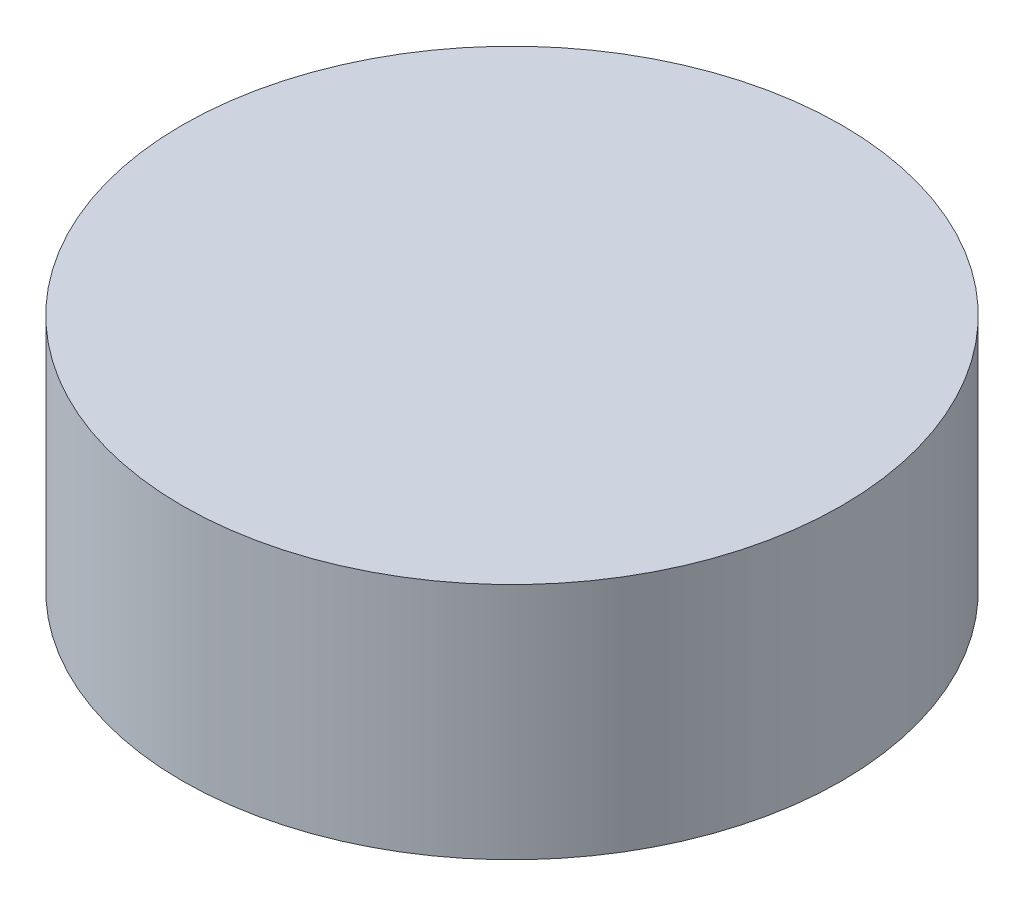
ISO-10303-21;
HEADER;
FILE_DESCRIPTION(('STEP AP214'),'2;1');
FILE_NAME('part.step','',(''),(''),'','','');
FILE_SCHEMA(('AUTOMOTIVE_DESIGN { 1 0 10303 214 1 1 1 1 }'));
ENDSEC;
DATA;
#1=APPLICATION_CONTEXT('core data for automotive mechanical design processes');
#2=APPLICATION_PROTOCOL_DEFINITION('international standard','automotive_design',2000,#1);
#3=PRODUCT_CONTEXT('',#1,'mechanical');
#4=PRODUCT('Part','Part','',(#3));
#5=PRODUCT_RELATED_PRODUCT_CATEGORY('part','',(#4));
#6=PRODUCT_DEFINITION_FORMATION('','',#4);
#7=PRODUCT_DEFINITION_CONTEXT('part definition',#1,'design');
#8=PRODUCT_DEFINITION('design','',#6,#7);
#9=PRODUCT_DEFINITION_SHAPE('','',#8);
#10=(LENGTH_UNIT() NAMED_UNIT(*) SI_UNIT(.MILLI.,.METRE.));
#11=(NAMED_UNIT(*) PLANE_ANGLE_UNIT() SI_UNIT($,.RADIAN.));
#12=(NAMED_UNIT(*) SI_UNIT($,.STERADIAN.) SOLID_ANGLE_UNIT());
#13=UNCERTAINTY_MEASURE_WITH_UNIT(LENGTH_MEASURE(1.E-05),#10,'distance_accuracy_value','');
#14=(GEOMETRIC_REPRESENTATION_CONTEXT(3) GLOBAL_UNCERTAINTY_ASSIGNED_CONTEXT((#13)) GLOBAL_UNIT_ASSIGNED_CONTEXT((#10,
#11,#12)) REPRESENTATION_CONTEXT('',''));
#15=CARTESIAN_POINT('',(0.,0.,0.));
#16=DIRECTION('',(0.,0.,1.));
#17=DIRECTION('',(1.,0.,0.));
#18=AXIS2_PLACEMENT_3D('',#15,#16,#17);
#19=CARTESIAN_POINT('',(-0.498,6.99999999999999,0.));
#20=DIRECTION('',(0.,1.,0.));
#21=DIRECTION('',(0.,0.,1.));
#22=AXIS2_PLACEMENT_3D('',#19,#20,#21);
#23=CYLINDRICAL_SURFACE('',#22,12.45);
#24=CARTESIAN_POINT('',(-0.498,6.99999999999999,0.));
#25=DIRECTION('',(0.,1.,0.));
#26=DIRECTION('',(0.,0.,1.));
#27=AXIS2_PLACEMENT_3D('',#24,#25,#26);
#28=CIRCLE('',#27,12.45);
#29=CARTESIAN_POINT('',(-0.498,6.99999999999999,12.45));
#30=VERTEX_POINT('',#29);
#31=EDGE_CURVE('E10',#30,#30,#28,.T.);
#32=ORIENTED_EDGE('',*,*,#31,.T.);
#33=EDGE_LOOP('',(#32));
#34=FACE_BOUND('',#33,.T.);
#35=CARTESIAN_POINT('',(-0.498,16.,0.));
#36=DIRECTION('',(0.,1.,0.));
#37=DIRECTION('',(0.,0.,1.));
#38=AXIS2_PLACEMENT_3D('',#35,#36,#37);
#39=CIRCLE('',#38,12.45);
#40=CARTESIAN_POINT('',(-0.498,16.,12.45));
#41=VERTEX_POINT('',#40);
#42=EDGE_CURVE('E43',#41,#41,#39,.T.);
#43=ORIENTED_EDGE('',*,*,#42,.F.);
#44=EDGE_LOOP('',(#43));
#45=FACE_BOUND('',#44,.T.);
#46=ADVANCED_FACE('F40',(#34,#45),#23,.T.);
#47=CARTESIAN_POINT('',(-0.498,6.99999999999999,0.));
#48=DIRECTION('',(0.,1.,0.));
#49=DIRECTION('',(0.,0.,1.));
#50=AXIS2_PLACEMENT_3D('',#47,#48,#49);
#51=PLANE('',#50);
#52=CARTESIAN_POINT('',(-0.5,6.99999999999999,0.));
#53=DIRECTION('',(0.,-1.,0.));
#54=DIRECTION('',(0.,0.,-1.));
#55=AXIS2_PLACEMENT_3D('',#52,#53,#54);
#56=CIRCLE('',#55,6.99999999999999);
#57=CARTESIAN_POINT('',(-0.5,6.99999999999999,-6.99999999999999));
#58=VERTEX_POINT('',#57);
#59=EDGE_CURVE('E87',#58,#58,#56,.T.);
#60=ORIENTED_EDGE('',*,*,#59,.F.);
#61=EDGE_LOOP('',(#60));
#62=FACE_BOUND('',#61,.T.);
#63=CARTESIAN_POINT('',(9.5,6.99999999999999,0.));
#64=DIRECTION('',(0.,-1.,0.));
#65=DIRECTION('',(0.,0.,-1.));
#66=AXIS2_PLACEMENT_3D('',#63,#64,#65);
#67=CIRCLE('',#66,1.475);
#68=CARTESIAN_POINT('',(9.5,6.99999999999999,-1.475));
#69=VERTEX_POINT('',#68);
#70=EDGE_CURVE('E51',#69,#69,#67,.T.);
#71=ORIENTED_EDGE('',*,*,#70,.F.);
#72=EDGE_LOOP('',(#71));
#73=FACE_BOUND('',#72,.T.);
#74=CARTESIAN_POINT('',(4.49999999999998,6.99999999999999,-8.66025403784439));
#75=DIRECTION('',(0.,-1.,0.));
#76=DIRECTION('',(0.,0.,-1.));
#77=AXIS2_PLACEMENT_3D('',#74,#75,#76);
#78=CIRCLE('',#77,1.475);
#79=CARTESIAN_POINT('',(4.49999999999998,6.99999999999999,-10.1352540378444));
#80=VERTEX_POINT('',#79);
#81=EDGE_CURVE('E59',#80,#80,#78,.T.);
#82=ORIENTED_EDGE('',*,*,#81,.F.);
#83=EDGE_LOOP('',(#82));
#84=FACE_BOUND('',#83,.T.);
#85=CARTESIAN_POINT('',(-5.50000000000004,6.99999999999999,-8.66025403784436));
#86=DIRECTION('',(0.,-1.,0.));
#87=DIRECTION('',(0.,0.,-1.));
#88=AXIS2_PLACEMENT_3D('',#85,#86,#87);
#89=CIRCLE('',#88,1.475);
#90=CARTESIAN_POINT('',(-5.50000000000004,6.99999999999999,-10.1352540378444));
#91=VERTEX_POINT('',#90);
#92=EDGE_CURVE('E60',#91,#91,#89,.T.);
#93=ORIENTED_EDGE('',*,*,#92,.F.);
#94=EDGE_LOOP('',(#93));
#95=FACE_BOUND('',#94,.T.);
#96=CARTESIAN_POINT('',(-10.5,6.99999999999999,0.));
#97=DIRECTION('',(0.,-1.,0.));
#98=DIRECTION('',(0.,0.,-1.));
#99=AXIS2_PLACEMENT_3D('',#96,#97,#98);
#100=CIRCLE('',#99,1.475);
#101=CARTESIAN_POINT('',(-10.5,6.99999999999999,-1.47499999999993));
#102=VERTEX_POINT('',#101);
#103=EDGE_CURVE('E61',#102,#102,#100,.T.);
#104=ORIENTED_EDGE('',*,*,#103,.F.);
#105=EDGE_LOOP('',(#104));
#106=FACE_BOUND('',#105,.T.);
#107=CARTESIAN_POINT('',(-5.49999999999992,6.99999999999999,8.66025403784443));
#108=DIRECTION('',(0.,-1.,0.));
#109=DIRECTION('',(0.,0.,-1.));
#110=AXIS2_PLACEMENT_3D('',#107,#108,#109);
#111=CIRCLE('',#110,1.475);
#112=CARTESIAN_POINT('',(-5.49999999999992,6.99999999999999,7.18525403784443));
#113=VERTEX_POINT('',#112);
#114=EDGE_CURVE('E66',#113,#113,#111,.T.);
#115=ORIENTED_EDGE('',*,*,#114,.F.);
#116=EDGE_LOOP('',(#115));
#117=FACE_BOUND('',#116,.T.);
#118=CARTESIAN_POINT('',(4.5000000000001,6.99999999999999,8.66025403784433));
#119=DIRECTION('',(0.,-1.,0.));
#120=DIRECTION('',(0.,0.,-1.));
#121=AXIS2_PLACEMENT_3D('',#118,#119,#120);
#122=CIRCLE('',#121,1.475);
#123=CARTESIAN_POINT('',(4.5000000000001,6.99999999999999,7.18525403784433));
#124=VERTEX_POINT('',#123);
#125=EDGE_CURVE('E77',#124,#124,#122,.T.);
#126=ORIENTED_EDGE('',*,*,#125,.F.);
#127=EDGE_LOOP('',(#126));
#128=FACE_BOUND('',#127,.T.);
#129=ORIENTED_EDGE('',*,*,#31,.F.);
#130=EDGE_LOOP('',(#129));
#131=FACE_BOUND('',#130,.T.);
#132=ADVANCED_FACE('F105',(#62,#73,#84,#95,#106,#117,#128,#131),#51,.F.);
#133=CARTESIAN_POINT('',(-0.498,16.,0.));
#134=DIRECTION('',(0.,1.,0.));
#135=DIRECTION('',(0.,0.,1.));
#136=AXIS2_PLACEMENT_3D('',#133,#134,#135);
#137=PLANE('',#136);
#138=ORIENTED_EDGE('',*,*,#42,.T.);
#139=EDGE_LOOP('',(#138));
#140=FACE_BOUND('',#139,.T.);
#141=ADVANCED_FACE('F104',(#140),#137,.T.);
#142=CARTESIAN_POINT('',(4.5000000000001,13.05,8.66025403784433));
#143=DIRECTION('',(0.,-1.,0.));
#144=DIRECTION('',(0.,0.,-1.));
#145=AXIS2_PLACEMENT_3D('',#142,#143,#144);
#146=CYLINDRICAL_SURFACE('',#145,1.475);
#147=CARTESIAN_POINT('',(4.5000000000001,13.05,8.66025403784433));
#148=DIRECTION('',(0.,-1.,0.));
#149=DIRECTION('',(0.,0.,-1.));
#150=AXIS2_PLACEMENT_3D('',#147,#148,#149);
#151=CIRCLE('',#150,1.475);
#152=CARTESIAN_POINT('',(4.5000000000001,13.05,7.18525403784433));
#153=VERTEX_POINT('',#152);
#154=EDGE_CURVE('E71',#153,#153,#151,.T.);
#155=ORIENTED_EDGE('',*,*,#154,.F.);
#156=EDGE_LOOP('',(#155));
#157=FACE_BOUND('',#156,.T.);
#158=ORIENTED_EDGE('',*,*,#125,.T.);
#159=EDGE_LOOP('',(#158));
#160=FACE_BOUND('',#159,.T.);
#161=ADVANCED_FACE('F116',(#157,#160),#146,.F.);
#162=CARTESIAN_POINT('',(4.5000000000001,13.05,8.66025403784433));
#163=DIRECTION('',(0.,-1.,0.));
#164=DIRECTION('',(0.,0.,-1.));
#165=AXIS2_PLACEMENT_3D('',#162,#163,#164);
#166=PLANE('',#165);
#167=ORIENTED_EDGE('',*,*,#154,.T.);
#168=EDGE_LOOP('',(#167));
#169=FACE_BOUND('',#168,.T.);
#170=ADVANCED_FACE('F123',(#169),#166,.T.);
#171=CARTESIAN_POINT('',(-5.49999999999992,13.05,8.66025403784443));
#172=DIRECTION('',(0.,-1.,0.));
#173=DIRECTION('',(0.,0.,-1.));
#174=AXIS2_PLACEMENT_3D('',#171,#172,#173);
#175=CYLINDRICAL_SURFACE('',#174,1.475);
#176=CARTESIAN_POINT('',(-5.49999999999992,13.05,8.66025403784443));
#177=DIRECTION('',(0.,-1.,0.));
#178=DIRECTION('',(0.,0.,-1.));
#179=AXIS2_PLACEMENT_3D('',#176,#177,#178);
#180=CIRCLE('',#179,1.475);
#181=CARTESIAN_POINT('',(-5.49999999999992,13.05,7.18525403784443));
#182=VERTEX_POINT('',#181);
#183=EDGE_CURVE('E69',#182,#182,#180,.T.);
#184=ORIENTED_EDGE('',*,*,#183,.F.);
#185=EDGE_LOOP('',(#184));
#186=FACE_BOUND('',#185,.T.);
#187=ORIENTED_EDGE('',*,*,#114,.T.);
#188=EDGE_LOOP('',(#187));
#189=FACE_BOUND('',#188,.T.);
#190=ADVANCED_FACE('F126',(#186,#189),#175,.F.);
#191=CARTESIAN_POINT('',(-5.49999999999992,13.05,8.66025403784443));
#192=DIRECTION('',(0.,-1.,0.));
#193=DIRECTION('',(0.,0.,-1.));
#194=AXIS2_PLACEMENT_3D('',#191,#192,#193);
#195=PLANE('',#194);
#196=ORIENTED_EDGE('',*,*,#183,.T.);
#197=EDGE_LOOP('',(#196));
#198=FACE_BOUND('',#197,.T.);
#199=ADVANCED_FACE('F170',(#198),#195,.T.);
#200=CARTESIAN_POINT('',(-10.5,13.05,0.));
#201=DIRECTION('',(0.,-1.,0.));
#202=DIRECTION('',(0.,0.,-1.));
#203=AXIS2_PLACEMENT_3D('',#200,#201,#202);
#204=CYLINDRICAL_SURFACE('',#203,1.475);
#205=CARTESIAN_POINT('',(-10.5,13.05,0.));
#206=DIRECTION('',(0.,-1.,0.));
#207=DIRECTION('',(0.,0.,-1.));
#208=AXIS2_PLACEMENT_3D('',#205,#206,#207);
#209=CIRCLE('',#208,1.475);
#210=CARTESIAN_POINT('',(-10.5,13.05,-1.47499999999993));
#211=VERTEX_POINT('',#210);
#212=EDGE_CURVE('E62',#211,#211,#209,.T.);
#213=ORIENTED_EDGE('',*,*,#212,.F.);
#214=EDGE_LOOP('',(#213));
#215=FACE_BOUND('',#214,.T.);
#216=ORIENTED_EDGE('',*,*,#103,.T.);
#217=EDGE_LOOP('',(#216));
#218=FACE_BOUND('',#217,.T.);
#219=ADVANCED_FACE('F179',(#215,#218),#204,.F.);
#220=CARTESIAN_POINT('',(-10.5,13.05,0.));
#221=DIRECTION('',(0.,-1.,0.));
#222=DIRECTION('',(0.,0.,-1.));
#223=AXIS2_PLACEMENT_3D('',#220,#221,#222);
#224=PLANE('',#223);
#225=ORIENTED_EDGE('',*,*,#212,.T.);
#226=EDGE_LOOP('',(#225));
#227=FACE_BOUND('',#226,.T.);
#228=ADVANCED_FACE('F190',(#227),#224,.T.);
#229=CARTESIAN_POINT('',(-5.50000000000004,13.05,-8.66025403784436));
#230=DIRECTION('',(0.,-1.,0.));
#231=DIRECTION('',(0.,0.,-1.));
#232=AXIS2_PLACEMENT_3D('',#229,#230,#231);
#233=CYLINDRICAL_SURFACE('',#232,1.475);
#234=CARTESIAN_POINT('',(-5.50000000000004,13.05,-8.66025403784436));
#235=DIRECTION('',(0.,-1.,0.));
#236=DIRECTION('',(0.,0.,-1.));
#237=AXIS2_PLACEMENT_3D('',#234,#235,#236);
#238=CIRCLE('',#237,1.475);
#239=CARTESIAN_POINT('',(-5.50000000000004,13.05,-10.1352540378444));
#240=VERTEX_POINT('',#239);
#241=EDGE_CURVE('E53',#240,#240,#238,.T.);
#242=ORIENTED_EDGE('',*,*,#241,.F.);
#243=EDGE_LOOP('',(#242));
#244=FACE_BOUND('',#243,.T.);
#245=ORIENTED_EDGE('',*,*,#92,.T.);
#246=EDGE_LOOP('',(#245));
#247=FACE_BOUND('',#246,.T.);
#248=ADVANCED_FACE('F197',(#244,#247),#233,.F.);
#249=CARTESIAN_POINT('',(-5.50000000000004,13.05,-8.66025403784436));
#250=DIRECTION('',(0.,-1.,0.));
#251=DIRECTION('',(0.,0.,-1.));
#252=AXIS2_PLACEMENT_3D('',#249,#250,#251);
#253=PLANE('',#252);
#254=ORIENTED_EDGE('',*,*,#241,.T.);
#255=EDGE_LOOP('',(#254));
#256=FACE_BOUND('',#255,.T.);
#257=ADVANCED_FACE('F210',(#256),#253,.T.);
#258=CARTESIAN_POINT('',(4.49999999999998,13.05,-8.66025403784439));
#259=DIRECTION('',(0.,-1.,0.));
#260=DIRECTION('',(0.,0.,-1.));
#261=AXIS2_PLACEMENT_3D('',#258,#259,#260);
#262=CYLINDRICAL_SURFACE('',#261,1.475);
#263=CARTESIAN_POINT('',(4.49999999999998,13.05,-8.66025403784439));
#264=DIRECTION('',(0.,-1.,0.));
#265=DIRECTION('',(0.,0.,-1.));
#266=AXIS2_PLACEMENT_3D('',#263,#264,#265);
#267=CIRCLE('',#266,1.475);
#268=CARTESIAN_POINT('',(4.49999999999998,13.05,-10.1352540378444));
#269=VERTEX_POINT('',#268);
#270=EDGE_CURVE('E76',#269,#269,#267,.T.);
#271=ORIENTED_EDGE('',*,*,#270,.F.);
#272=EDGE_LOOP('',(#271));
#273=FACE_BOUND('',#272,.T.);
#274=ORIENTED_EDGE('',*,*,#81,.T.);
#275=EDGE_LOOP('',(#274));
#276=FACE_BOUND('',#275,.T.);
#277=ADVANCED_FACE('F220',(#273,#276),#262,.F.);
#278=CARTESIAN_POINT('',(4.49999999999998,13.05,-8.66025403784439));
#279=DIRECTION('',(0.,-1.,0.));
#280=DIRECTION('',(0.,0.,-1.));
#281=AXIS2_PLACEMENT_3D('',#278,#279,#280);
#282=PLANE('',#281);
#283=ORIENTED_EDGE('',*,*,#270,.T.);
#284=EDGE_LOOP('',(#283));
#285=FACE_BOUND('',#284,.T.);
#286=ADVANCED_FACE('F230',(#285),#282,.T.);
#287=CARTESIAN_POINT('',(9.5,13.05,0.));
#288=DIRECTION('',(0.,-1.,0.));
#289=DIRECTION('',(0.,0.,-1.));
#290=AXIS2_PLACEMENT_3D('',#287,#288,#289);
#291=CYLINDRICAL_SURFACE('',#290,1.475);
#292=CARTESIAN_POINT('',(9.5,13.05,0.));
#293=DIRECTION('',(0.,-1.,0.));
#294=DIRECTION('',(0.,0.,-1.));
#295=AXIS2_PLACEMENT_3D('',#292,#293,#294);
#296=CIRCLE('',#295,1.475);
#297=CARTESIAN_POINT('',(9.5,13.05,-1.475));
#298=VERTEX_POINT('',#297);
#299=EDGE_CURVE('E50',#298,#298,#296,.T.);
#300=ORIENTED_EDGE('',*,*,#299,.F.);
#301=EDGE_LOOP('',(#300));
#302=FACE_BOUND('',#301,.T.);
#303=ORIENTED_EDGE('',*,*,#70,.T.);
#304=EDGE_LOOP('',(#303));
#305=FACE_BOUND('',#304,.T.);
#306=ADVANCED_FACE('F240',(#302,#305),#291,.F.);
#307=CARTESIAN_POINT('',(9.5,13.05,0.));
#308=DIRECTION('',(0.,-1.,0.));
#309=DIRECTION('',(0.,0.,-1.));
#310=AXIS2_PLACEMENT_3D('',#307,#308,#309);
#311=PLANE('',#310);
#312=ORIENTED_EDGE('',*,*,#299,.T.);
#313=EDGE_LOOP('',(#312));
#314=FACE_BOUND('',#313,.T.);
#315=ADVANCED_FACE('F98',(#314),#311,.T.);
#316=CARTESIAN_POINT('',(-0.5,11.05,0.));
#317=DIRECTION('',(0.,-1.,0.));
#318=DIRECTION('',(0.,0.,-1.));
#319=AXIS2_PLACEMENT_3D('',#316,#317,#318);
#320=CYLINDRICAL_SURFACE('',#319,6.99999999999999);
#321=CARTESIAN_POINT('',(-0.5,11.05,0.));
#322=DIRECTION('',(0.,-1.,0.));
#323=DIRECTION('',(0.,0.,-1.));
#324=AXIS2_PLACEMENT_3D('',#321,#322,#323);
#325=CIRCLE('',#324,6.99999999999999);
#326=CARTESIAN_POINT('',(-0.5,11.05,-6.99999999999999));
#327=VERTEX_POINT('',#326);
#328=EDGE_CURVE('E84',#327,#327,#325,.T.);
#329=ORIENTED_EDGE('',*,*,#328,.F.);
#330=EDGE_LOOP('',(#329));
#331=FACE_BOUND('',#330,.T.);
#332=ORIENTED_EDGE('',*,*,#59,.T.);
#333=EDGE_LOOP('',(#332));
#334=FACE_BOUND('',#333,.T.);
#335=ADVANCED_FACE('F92',(#331,#334),#320,.F.);
#336=CARTESIAN_POINT('',(-0.5,11.05,0.));
#337=DIRECTION('',(0.,-1.,0.));
#338=DIRECTION('',(0.,0.,-1.));
#339=AXIS2_PLACEMENT_3D('',#336,#337,#338);
#340=PLANE('',#339);
#341=ORIENTED_EDGE('',*,*,#328,.T.);
#342=EDGE_LOOP('',(#341));
#343=FACE_BOUND('',#342,.T.);
#344=ADVANCED_FACE('F91',(#343),#340,.T.);
#345=CLOSED_SHELL('',(#46,#132,#141,#161,#170,#190,#199,#219,#228,#248,#257,#277,#286,#306,#315,
#335,#344));
#346=MANIFOLD_SOLID_BREP('B2',#345);
#347=ADVANCED_BREP_SHAPE_REPRESENTATION('',(#18,#346),#14);
#348=SHAPE_DEFINITION_REPRESENTATION(#9,#347);
ENDSEC;
END-ISO-10303-21;
